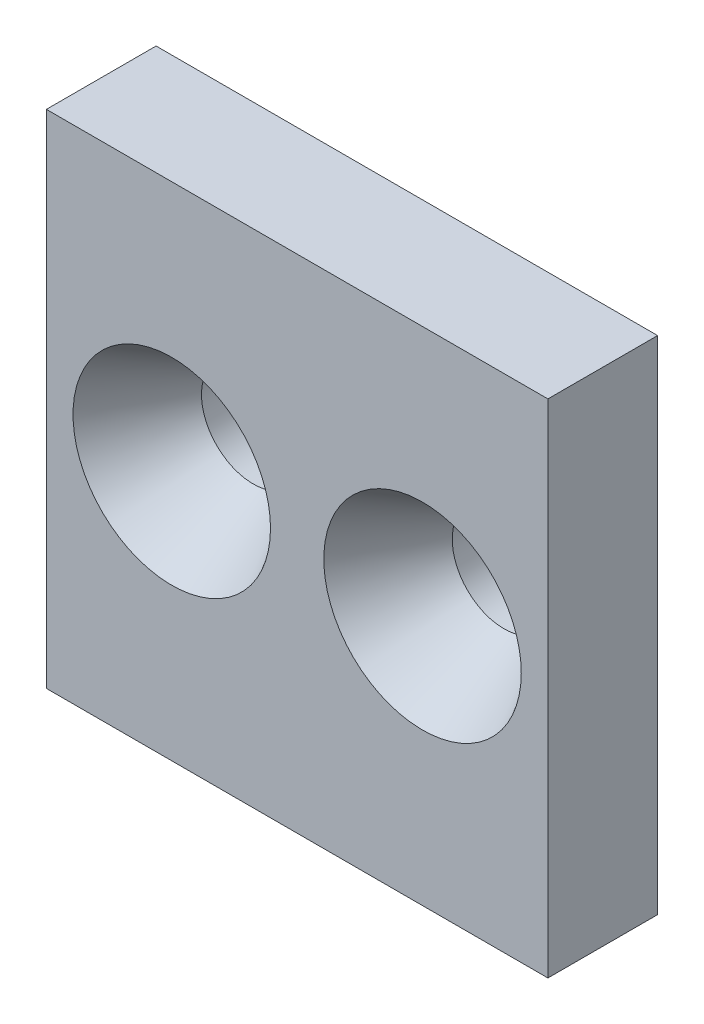
ISO-10303-21;
HEADER;
FILE_DESCRIPTION(('STEP AP214'),'2;1');
FILE_NAME('part.step','',(''),(''),'','','');
FILE_SCHEMA(('AUTOMOTIVE_DESIGN { 1 0 10303 214 1 1 1 1 }'));
ENDSEC;
DATA;
#1=APPLICATION_CONTEXT('core data for automotive mechanical design processes');
#2=APPLICATION_PROTOCOL_DEFINITION('international standard','automotive_design',2000,#1);
#3=PRODUCT_CONTEXT('',#1,'mechanical');
#4=PRODUCT('Part','Part','',(#3));
#5=PRODUCT_RELATED_PRODUCT_CATEGORY('part','',(#4));
#6=PRODUCT_DEFINITION_FORMATION('','',#4);
#7=PRODUCT_DEFINITION_CONTEXT('part definition',#1,'design');
#8=PRODUCT_DEFINITION('design','',#6,#7);
#9=PRODUCT_DEFINITION_SHAPE('','',#8);
#10=(LENGTH_UNIT() NAMED_UNIT(*) SI_UNIT(.MILLI.,.METRE.));
#11=(NAMED_UNIT(*) PLANE_ANGLE_UNIT() SI_UNIT($,.RADIAN.));
#12=(NAMED_UNIT(*) SI_UNIT($,.STERADIAN.) SOLID_ANGLE_UNIT());
#13=UNCERTAINTY_MEASURE_WITH_UNIT(LENGTH_MEASURE(1.E-05),#10,'distance_accuracy_value','');
#14=(GEOMETRIC_REPRESENTATION_CONTEXT(3) GLOBAL_UNCERTAINTY_ASSIGNED_CONTEXT((#13)) GLOBAL_UNIT_ASSIGNED_CONTEXT((#10,
#11,#12)) REPRESENTATION_CONTEXT('',''));
#15=CARTESIAN_POINT('',(0.,0.,0.));
#16=DIRECTION('',(0.,0.,1.));
#17=DIRECTION('',(1.,0.,0.));
#18=AXIS2_PLACEMENT_3D('',#15,#16,#17);
#19=CARTESIAN_POINT('',(0.,0.,7.));
#20=DIRECTION('',(1.,0.,0.));
#21=DIRECTION('',(0.,0.,-1.));
#22=AXIS2_PLACEMENT_3D('',#19,#20,#21);
#23=PLANE('',#22);
#24=DIRECTION('',(0.,-1.,0.));
#25=VECTOR('',#24,1.);
#26=CARTESIAN_POINT('',(0.,0.,0.));
#27=LINE('',#26,#25);
#28=CARTESIAN_POINT('',(0.,32.,0.));
#29=VERTEX_POINT('',#28);
#30=CARTESIAN_POINT('',(0.,0.,0.));
#31=VERTEX_POINT('',#30);
#32=EDGE_CURVE('E97',#29,#31,#27,.T.);
#33=ORIENTED_EDGE('',*,*,#32,.T.);
#34=DIRECTION('',(0.,0.,-1.));
#35=VECTOR('',#34,1.);
#36=CARTESIAN_POINT('',(0.,0.,7.));
#37=LINE('',#36,#35);
#38=CARTESIAN_POINT('',(0.,0.,7.));
#39=VERTEX_POINT('',#38);
#40=EDGE_CURVE('E11',#39,#31,#37,.T.);
#41=ORIENTED_EDGE('',*,*,#40,.F.);
#42=DIRECTION('',(0.,-1.,0.));
#43=VECTOR('',#42,1.);
#44=CARTESIAN_POINT('',(0.,0.,7.));
#45=LINE('',#44,#43);
#46=CARTESIAN_POINT('',(0.,32.,7.));
#47=VERTEX_POINT('',#46);
#48=EDGE_CURVE('E85',#47,#39,#45,.T.);
#49=ORIENTED_EDGE('',*,*,#48,.F.);
#50=DIRECTION('',(0.,0.,-1.));
#51=VECTOR('',#50,1.);
#52=CARTESIAN_POINT('',(0.,32.,7.));
#53=LINE('',#52,#51);
#54=EDGE_CURVE('E93',#47,#29,#53,.T.);
#55=ORIENTED_EDGE('',*,*,#54,.T.);
#56=EDGE_LOOP('',(#33,#41,#49,#55));
#57=FACE_BOUND('',#56,.T.);
#58=ADVANCED_FACE('F34',(#57),#23,.F.);
#59=CARTESIAN_POINT('',(0.,0.,7.));
#60=DIRECTION('',(0.,1.,0.));
#61=DIRECTION('',(0.,0.,1.));
#62=AXIS2_PLACEMENT_3D('',#59,#60,#61);
#63=PLANE('',#62);
#64=DIRECTION('',(1.,0.,0.));
#65=VECTOR('',#64,1.);
#66=CARTESIAN_POINT('',(0.,0.,0.));
#67=LINE('',#66,#65);
#68=CARTESIAN_POINT('',(32.,0.,0.));
#69=VERTEX_POINT('',#68);
#70=EDGE_CURVE('E89',#31,#69,#67,.T.);
#71=ORIENTED_EDGE('',*,*,#70,.T.);
#72=DIRECTION('',(0.,0.,-1.));
#73=VECTOR('',#72,1.);
#74=CARTESIAN_POINT('',(32.,0.,7.));
#75=LINE('',#74,#73);
#76=CARTESIAN_POINT('',(32.,0.,7.));
#77=VERTEX_POINT('',#76);
#78=EDGE_CURVE('E42',#77,#69,#75,.T.);
#79=ORIENTED_EDGE('',*,*,#78,.F.);
#80=DIRECTION('',(1.,0.,0.));
#81=VECTOR('',#80,1.);
#82=CARTESIAN_POINT('',(0.,0.,7.));
#83=LINE('',#82,#81);
#84=EDGE_CURVE('E80',#39,#77,#83,.T.);
#85=ORIENTED_EDGE('',*,*,#84,.F.);
#86=ORIENTED_EDGE('',*,*,#40,.T.);
#87=EDGE_LOOP('',(#71,#79,#85,#86));
#88=FACE_BOUND('',#87,.T.);
#89=ADVANCED_FACE('F88',(#88),#63,.F.);
#90=CARTESIAN_POINT('',(32.,0.,7.));
#91=DIRECTION('',(-1.,0.,0.));
#92=DIRECTION('',(0.,0.,1.));
#93=AXIS2_PLACEMENT_3D('',#90,#91,#92);
#94=PLANE('',#93);
#95=DIRECTION('',(0.,1.,0.));
#96=VECTOR('',#95,1.);
#97=CARTESIAN_POINT('',(32.,0.,0.));
#98=LINE('',#97,#96);
#99=CARTESIAN_POINT('',(32.,32.,0.));
#100=VERTEX_POINT('',#99);
#101=EDGE_CURVE('E67',#69,#100,#98,.T.);
#102=ORIENTED_EDGE('',*,*,#101,.T.);
#103=DIRECTION('',(0.,0.,-1.));
#104=VECTOR('',#103,1.);
#105=CARTESIAN_POINT('',(32.,32.,7.));
#106=LINE('',#105,#104);
#107=CARTESIAN_POINT('',(32.,32.,7.));
#108=VERTEX_POINT('',#107);
#109=EDGE_CURVE('E90',#108,#100,#106,.T.);
#110=ORIENTED_EDGE('',*,*,#109,.F.);
#111=DIRECTION('',(0.,1.,0.));
#112=VECTOR('',#111,1.);
#113=CARTESIAN_POINT('',(32.,0.,7.));
#114=LINE('',#113,#112);
#115=EDGE_CURVE('E83',#77,#108,#114,.T.);
#116=ORIENTED_EDGE('',*,*,#115,.F.);
#117=ORIENTED_EDGE('',*,*,#78,.T.);
#118=EDGE_LOOP('',(#102,#110,#116,#117));
#119=FACE_BOUND('',#118,.T.);
#120=ADVANCED_FACE('F91',(#119),#94,.F.);
#121=CARTESIAN_POINT('',(0.,32.,7.));
#122=DIRECTION('',(0.,-1.,0.));
#123=DIRECTION('',(0.,0.,-1.));
#124=AXIS2_PLACEMENT_3D('',#121,#122,#123);
#125=PLANE('',#124);
#126=DIRECTION('',(-1.,0.,0.));
#127=VECTOR('',#126,1.);
#128=CARTESIAN_POINT('',(0.,32.,0.));
#129=LINE('',#128,#127);
#130=EDGE_CURVE('E73',#100,#29,#129,.T.);
#131=ORIENTED_EDGE('',*,*,#130,.T.);
#132=ORIENTED_EDGE('',*,*,#54,.F.);
#133=DIRECTION('',(-1.,0.,0.));
#134=VECTOR('',#133,1.);
#135=CARTESIAN_POINT('',(0.,32.,7.));
#136=LINE('',#135,#134);
#137=EDGE_CURVE('E50',#108,#47,#136,.T.);
#138=ORIENTED_EDGE('',*,*,#137,.F.);
#139=ORIENTED_EDGE('',*,*,#109,.T.);
#140=EDGE_LOOP('',(#131,#132,#138,#139));
#141=FACE_BOUND('',#140,.T.);
#142=ADVANCED_FACE('F105',(#141),#125,.F.);
#143=CARTESIAN_POINT('',(0.,32.,7.));
#144=DIRECTION('',(0.,0.,-1.));
#145=DIRECTION('',(-1.,0.,0.));
#146=AXIS2_PLACEMENT_3D('',#143,#144,#145);
#147=PLANE('',#146);
#148=CARTESIAN_POINT('',(8.,16.,7.));
#149=DIRECTION('',(0.,0.,1.));
#150=DIRECTION('',(1.,0.,0.));
#151=AXIS2_PLACEMENT_3D('',#148,#149,#150);
#152=CIRCLE('',#151,6.3);
#153=CARTESIAN_POINT('',(14.3,16.,7.));
#154=VERTEX_POINT('',#153);
#155=EDGE_CURVE('E125',#154,#154,#152,.T.);
#156=ORIENTED_EDGE('',*,*,#155,.F.);
#157=EDGE_LOOP('',(#156));
#158=FACE_BOUND('',#157,.T.);
#159=CARTESIAN_POINT('',(24.,16.,7.));
#160=DIRECTION('',(0.,0.,1.));
#161=DIRECTION('',(1.,0.,0.));
#162=AXIS2_PLACEMENT_3D('',#159,#160,#161);
#163=CIRCLE('',#162,6.3);
#164=CARTESIAN_POINT('',(30.3,16.,7.));
#165=VERTEX_POINT('',#164);
#166=EDGE_CURVE('E116',#165,#165,#163,.T.);
#167=ORIENTED_EDGE('',*,*,#166,.F.);
#168=EDGE_LOOP('',(#167));
#169=FACE_BOUND('',#168,.T.);
#170=ORIENTED_EDGE('',*,*,#48,.T.);
#171=ORIENTED_EDGE('',*,*,#84,.T.);
#172=ORIENTED_EDGE('',*,*,#115,.T.);
#173=ORIENTED_EDGE('',*,*,#137,.T.);
#174=EDGE_LOOP('',(#170,#171,#172,#173));
#175=FACE_BOUND('',#174,.T.);
#176=ADVANCED_FACE('F81',(#158,#169,#175),#147,.F.);
#177=CARTESIAN_POINT('',(0.,32.,0.));
#178=DIRECTION('',(0.,0.,-1.));
#179=DIRECTION('',(-1.,0.,0.));
#180=AXIS2_PLACEMENT_3D('',#177,#178,#179);
#181=PLANE('',#180);
#182=CARTESIAN_POINT('',(8.,16.,0.));
#183=DIRECTION('',(0.,0.,1.));
#184=DIRECTION('',(1.,0.,0.));
#185=AXIS2_PLACEMENT_3D('',#182,#183,#184);
#186=CIRCLE('',#185,3.3);
#187=CARTESIAN_POINT('',(11.3,16.,0.));
#188=VERTEX_POINT('',#187);
#189=EDGE_CURVE('E119',#188,#188,#186,.T.);
#190=ORIENTED_EDGE('',*,*,#189,.T.);
#191=EDGE_LOOP('',(#190));
#192=FACE_BOUND('',#191,.T.);
#193=CARTESIAN_POINT('',(24.,16.,0.));
#194=DIRECTION('',(0.,0.,1.));
#195=DIRECTION('',(1.,0.,0.));
#196=AXIS2_PLACEMENT_3D('',#193,#194,#195);
#197=CIRCLE('',#196,3.3);
#198=CARTESIAN_POINT('',(27.3,16.,0.));
#199=VERTEX_POINT('',#198);
#200=EDGE_CURVE('E100',#199,#199,#197,.T.);
#201=ORIENTED_EDGE('',*,*,#200,.T.);
#202=EDGE_LOOP('',(#201));
#203=FACE_BOUND('',#202,.T.);
#204=ORIENTED_EDGE('',*,*,#32,.F.);
#205=ORIENTED_EDGE('',*,*,#130,.F.);
#206=ORIENTED_EDGE('',*,*,#101,.F.);
#207=ORIENTED_EDGE('',*,*,#70,.F.);
#208=EDGE_LOOP('',(#204,#205,#206,#207));
#209=FACE_BOUND('',#208,.T.);
#210=ADVANCED_FACE('F108',(#192,#203,#209),#181,.T.);
#211=CARTESIAN_POINT('',(24.,16.,7.));
#212=DIRECTION('',(0.,0.,1.));
#213=DIRECTION('',(1.,0.,0.));
#214=AXIS2_PLACEMENT_3D('',#211,#212,#213);
#215=CYLINDRICAL_SURFACE('',#214,3.3);
#216=ORIENTED_EDGE('',*,*,#200,.F.);
#217=EDGE_LOOP('',(#216));
#218=FACE_BOUND('',#217,.T.);
#219=CARTESIAN_POINT('',(24.,16.,1.80384757729337));
#220=DIRECTION('',(0.,0.,1.));
#221=DIRECTION('',(1.,0.,0.));
#222=AXIS2_PLACEMENT_3D('',#219,#220,#221);
#223=CIRCLE('',#222,3.3);
#224=CARTESIAN_POINT('',(27.3,16.,1.80384757729337));
#225=VERTEX_POINT('',#224);
#226=EDGE_CURVE('E113',#225,#225,#223,.T.);
#227=ORIENTED_EDGE('',*,*,#226,.T.);
#228=EDGE_LOOP('',(#227));
#229=FACE_BOUND('',#228,.T.);
#230=ADVANCED_FACE('F139',(#218,#229),#215,.F.);
#231=CARTESIAN_POINT('',(24.,16.,7.));
#232=DIRECTION('',(0.,0.,1.));
#233=DIRECTION('',(1.,0.,0.));
#234=AXIS2_PLACEMENT_3D('',#231,#232,#233);
#235=CONICAL_SURFACE('',#234,6.3,0.523598775598299);
#236=ORIENTED_EDGE('',*,*,#226,.F.);
#237=EDGE_LOOP('',(#236));
#238=FACE_BOUND('',#237,.T.);
#239=ORIENTED_EDGE('',*,*,#166,.T.);
#240=EDGE_LOOP('',(#239));
#241=FACE_BOUND('',#240,.T.);
#242=ADVANCED_FACE('F136',(#238,#241),#235,.F.);
#243=CARTESIAN_POINT('',(8.,16.,7.));
#244=DIRECTION('',(0.,0.,1.));
#245=DIRECTION('',(1.,0.,0.));
#246=AXIS2_PLACEMENT_3D('',#243,#244,#245);
#247=CYLINDRICAL_SURFACE('',#246,3.3);
#248=ORIENTED_EDGE('',*,*,#189,.F.);
#249=EDGE_LOOP('',(#248));
#250=FACE_BOUND('',#249,.T.);
#251=CARTESIAN_POINT('',(8.,16.,1.80384757729337));
#252=DIRECTION('',(0.,0.,1.));
#253=DIRECTION('',(1.,0.,0.));
#254=AXIS2_PLACEMENT_3D('',#251,#252,#253);
#255=CIRCLE('',#254,3.3);
#256=CARTESIAN_POINT('',(11.3,16.,1.80384757729337));
#257=VERTEX_POINT('',#256);
#258=EDGE_CURVE('E122',#257,#257,#255,.T.);
#259=ORIENTED_EDGE('',*,*,#258,.T.);
#260=EDGE_LOOP('',(#259));
#261=FACE_BOUND('',#260,.T.);
#262=ADVANCED_FACE('F138',(#250,#261),#247,.F.);
#263=CARTESIAN_POINT('',(8.,16.,7.));
#264=DIRECTION('',(0.,0.,1.));
#265=DIRECTION('',(1.,0.,0.));
#266=AXIS2_PLACEMENT_3D('',#263,#264,#265);
#267=CONICAL_SURFACE('',#266,6.3,0.523598775598299);
#268=ORIENTED_EDGE('',*,*,#258,.F.);
#269=EDGE_LOOP('',(#268));
#270=FACE_BOUND('',#269,.T.);
#271=ORIENTED_EDGE('',*,*,#155,.T.);
#272=EDGE_LOOP('',(#271));
#273=FACE_BOUND('',#272,.T.);
#274=ADVANCED_FACE('F129',(#270,#273),#267,.F.);
#275=CLOSED_SHELL('',(#58,#89,#120,#142,#176,#210,#230,#242,#262,#274));
#276=MANIFOLD_SOLID_BREP('B2',#275);
#277=ADVANCED_BREP_SHAPE_REPRESENTATION('',(#18,#276),#14);
#278=SHAPE_DEFINITION_REPRESENTATION(#9,#277);
ENDSEC;
END-ISO-10303-21;
